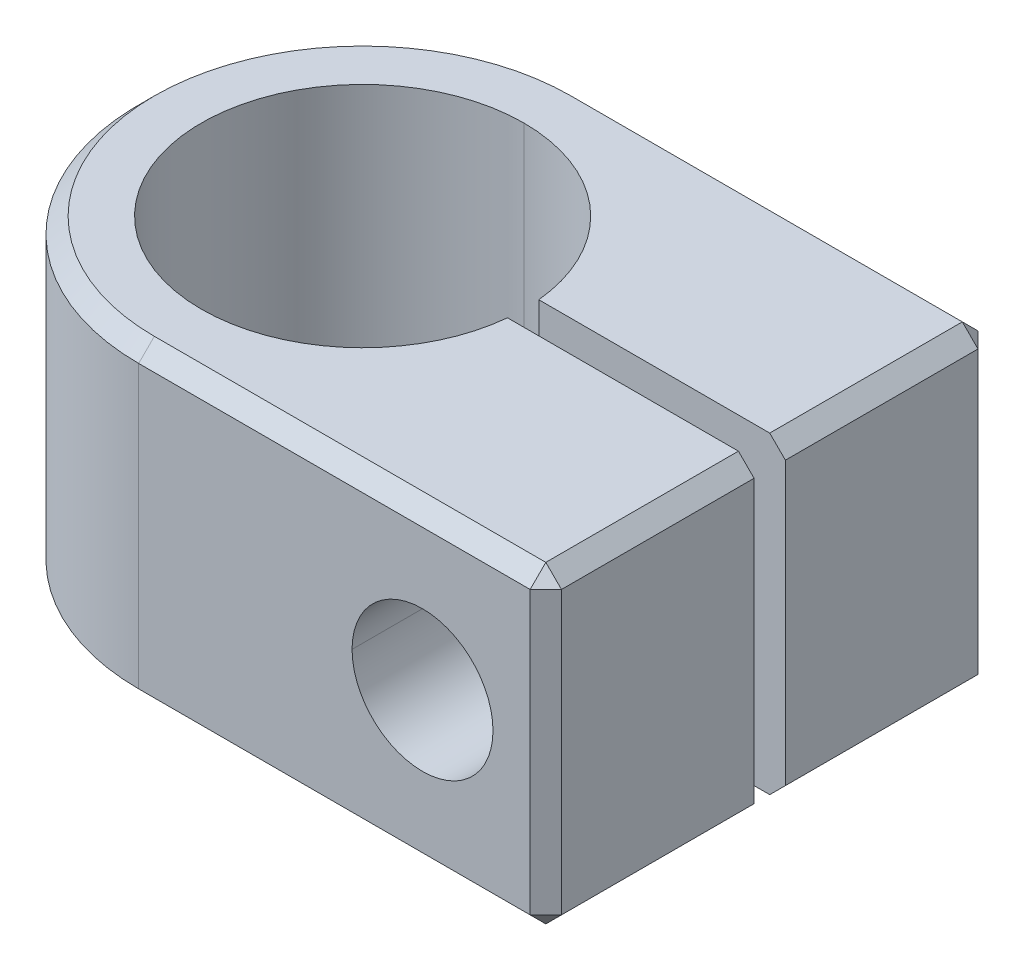
ISO-10303-21;
HEADER;
FILE_DESCRIPTION(('STEP AP214'),'2;1');
FILE_NAME('part.step','',(''),(''),'','','');
FILE_SCHEMA(('AUTOMOTIVE_DESIGN { 1 0 10303 214 1 1 1 1 }'));
ENDSEC;
DATA;
#1=APPLICATION_CONTEXT('core data for automotive mechanical design processes');
#2=APPLICATION_PROTOCOL_DEFINITION('international standard','automotive_design',2000,#1);
#3=PRODUCT_CONTEXT('',#1,'mechanical');
#4=PRODUCT('Part','Part','',(#3));
#5=PRODUCT_RELATED_PRODUCT_CATEGORY('part','',(#4));
#6=PRODUCT_DEFINITION_FORMATION('','',#4);
#7=PRODUCT_DEFINITION_CONTEXT('part definition',#1,'design');
#8=PRODUCT_DEFINITION('design','',#6,#7);
#9=PRODUCT_DEFINITION_SHAPE('','',#8);
#10=(LENGTH_UNIT() NAMED_UNIT(*) SI_UNIT(.MILLI.,.METRE.));
#11=(NAMED_UNIT(*) PLANE_ANGLE_UNIT() SI_UNIT($,.RADIAN.));
#12=(NAMED_UNIT(*) SI_UNIT($,.STERADIAN.) SOLID_ANGLE_UNIT());
#13=UNCERTAINTY_MEASURE_WITH_UNIT(LENGTH_MEASURE(1.E-05),#10,'distance_accuracy_value','');
#14=(GEOMETRIC_REPRESENTATION_CONTEXT(3) GLOBAL_UNCERTAINTY_ASSIGNED_CONTEXT((#13)) GLOBAL_UNIT_ASSIGNED_CONTEXT((#10,
#11,#12)) REPRESENTATION_CONTEXT('',''));
#15=CARTESIAN_POINT('',(0.,0.,0.));
#16=DIRECTION('',(0.,0.,1.));
#17=DIRECTION('',(1.,0.,0.));
#18=AXIS2_PLACEMENT_3D('',#15,#16,#17);
#19=CARTESIAN_POINT('',(13.,0.5,-7.15));
#20=DIRECTION('',(-0.707106781186548,0.707106781186548,0.));
#21=DIRECTION('',(0.,0.,1.));
#22=AXIS2_PLACEMENT_3D('',#19,#20,#21);
#23=PLANE('',#22);
#24=DIRECTION('',(0.707106781186548,0.707106781186548,0.));
#25=VECTOR('',#24,1.);
#26=CARTESIAN_POINT('',(13.,0.5,-0.5));
#27=LINE('',#26,#25);
#28=CARTESIAN_POINT('',(12.5,0.,-0.5));
#29=VERTEX_POINT('',#28);
#30=CARTESIAN_POINT('',(13.,0.5,-0.5));
#31=VERTEX_POINT('',#30);
#32=EDGE_CURVE('E200',#29,#31,#27,.T.);
#33=ORIENTED_EDGE('',*,*,#32,.F.);
#34=DIRECTION('',(0.,0.,1.));
#35=VECTOR('',#34,1.);
#36=CARTESIAN_POINT('',(12.5,0.,0.));
#37=LINE('',#36,#35);
#38=CARTESIAN_POINT('',(12.5,0.,-6.65));
#39=VERTEX_POINT('',#38);
#40=EDGE_CURVE('E1141',#39,#29,#37,.T.);
#41=ORIENTED_EDGE('',*,*,#40,.F.);
#42=DIRECTION('',(0.707106781186548,0.707106781186548,0.));
#43=VECTOR('',#42,1.);
#44=CARTESIAN_POINT('',(13.,0.5,-6.65));
#45=LINE('',#44,#43);
#46=CARTESIAN_POINT('',(13.,0.5,-6.65));
#47=VERTEX_POINT('',#46);
#48=EDGE_CURVE('E11',#39,#47,#45,.T.);
#49=ORIENTED_EDGE('',*,*,#48,.T.);
#50=DIRECTION('',(0.,0.,-1.));
#51=VECTOR('',#50,1.);
#52=CARTESIAN_POINT('',(13.,0.5,-7.15));
#53=LINE('',#52,#51);
#54=EDGE_CURVE('E1026',#31,#47,#53,.T.);
#55=ORIENTED_EDGE('',*,*,#54,.F.);
#56=EDGE_LOOP('',(#33,#41,#49,#55));
#57=FACE_BOUND('',#56,.T.);
#58=ADVANCED_FACE('F17',(#57),#23,.F.);
#59=CARTESIAN_POINT('',(13.,0.5,-6.65));
#60=DIRECTION('',(0.577350269189621,-0.577350269189629,-0.577350269189627));
#61=DIRECTION('',(0.,0.707106781186546,-0.707106781186549));
#62=AXIS2_PLACEMENT_3D('',#59,#60,#61);
#63=PLANE('',#62);
#64=DIRECTION('',(0.,0.707106781186546,-0.707106781186549));
#65=VECTOR('',#64,1.);
#66=CARTESIAN_POINT('',(12.5,0.25,-6.9));
#67=LINE('',#66,#65);
#68=CARTESIAN_POINT('',(12.5,0.5,-7.15));
#69=VERTEX_POINT('',#68);
#70=EDGE_CURVE('E26',#39,#69,#67,.T.);
#71=ORIENTED_EDGE('',*,*,#70,.T.);
#72=DIRECTION('',(0.707106781186548,0.,0.707106781186548));
#73=VECTOR('',#72,1.);
#74=CARTESIAN_POINT('',(13.,0.5,-6.65));
#75=LINE('',#74,#73);
#76=EDGE_CURVE('E256',#69,#47,#75,.T.);
#77=ORIENTED_EDGE('',*,*,#76,.T.);
#78=ORIENTED_EDGE('',*,*,#48,.F.);
#79=EDGE_LOOP('',(#71,#77,#78));
#80=FACE_BOUND('',#79,.T.);
#81=ADVANCED_FACE('F19',(#80),#63,.T.);
#82=CARTESIAN_POINT('',(0.,0.5,-7.15));
#83=DIRECTION('',(0.,0.707106781186549,0.707106781186546));
#84=DIRECTION('',(1.,0.,0.));
#85=AXIS2_PLACEMENT_3D('',#82,#83,#84);
#86=PLANE('',#85);
#87=DIRECTION('',(0.,0.707106781186546,-0.707106781186549));
#88=VECTOR('',#87,1.);
#89=CARTESIAN_POINT('',(0.,0.,-6.65));
#90=LINE('',#89,#88);
#91=CARTESIAN_POINT('',(0.,0.,-6.65));
#92=VERTEX_POINT('',#91);
#93=CARTESIAN_POINT('',(0.,0.5,-7.15));
#94=VERTEX_POINT('',#93);
#95=EDGE_CURVE('E253',#92,#94,#90,.T.);
#96=ORIENTED_EDGE('',*,*,#95,.T.);
#97=DIRECTION('',(-1.,0.,0.));
#98=VECTOR('',#97,1.);
#99=CARTESIAN_POINT('',(0.,0.5,-7.15));
#100=LINE('',#99,#98);
#101=EDGE_CURVE('E209',#69,#94,#100,.T.);
#102=ORIENTED_EDGE('',*,*,#101,.F.);
#103=ORIENTED_EDGE('',*,*,#70,.F.);
#104=DIRECTION('',(1.,0.,0.));
#105=VECTOR('',#104,1.);
#106=CARTESIAN_POINT('',(0.,0.,-6.65));
#107=LINE('',#106,#105);
#108=EDGE_CURVE('E1137',#92,#39,#107,.T.);
#109=ORIENTED_EDGE('',*,*,#108,.F.);
#110=EDGE_LOOP('',(#96,#102,#103,#109));
#111=FACE_BOUND('',#110,.T.);
#112=ADVANCED_FACE('F757',(#111),#86,.F.);
#113=CARTESIAN_POINT('',(12.5,10.,-7.15));
#114=DIRECTION('',(-0.707106781186548,0.,0.707106781186548));
#115=DIRECTION('',(0.,1.,0.));
#116=AXIS2_PLACEMENT_3D('',#113,#114,#115);
#117=PLANE('',#116);
#118=DIRECTION('',(0.707106781186548,0.,0.707106781186548));
#119=VECTOR('',#118,1.);
#120=CARTESIAN_POINT('',(13.,9.5,-6.65));
#121=LINE('',#120,#119);
#122=CARTESIAN_POINT('',(12.5,9.5,-7.15));
#123=VERTEX_POINT('',#122);
#124=CARTESIAN_POINT('',(13.,9.5,-6.65));
#125=VERTEX_POINT('',#124);
#126=EDGE_CURVE('E52',#123,#125,#121,.T.);
#127=ORIENTED_EDGE('',*,*,#126,.T.);
#128=DIRECTION('',(0.,1.,0.));
#129=VECTOR('',#128,1.);
#130=CARTESIAN_POINT('',(13.,10.,-6.65));
#131=LINE('',#130,#129);
#132=EDGE_CURVE('E1029',#47,#125,#131,.T.);
#133=ORIENTED_EDGE('',*,*,#132,.F.);
#134=ORIENTED_EDGE('',*,*,#76,.F.);
#135=DIRECTION('',(0.,-1.,0.));
#136=VECTOR('',#135,1.);
#137=CARTESIAN_POINT('',(12.5,10.,-7.15));
#138=LINE('',#137,#136);
#139=EDGE_CURVE('E208',#123,#69,#138,.T.);
#140=ORIENTED_EDGE('',*,*,#139,.F.);
#141=EDGE_LOOP('',(#127,#133,#134,#140));
#142=FACE_BOUND('',#141,.T.);
#143=ADVANCED_FACE('F746',(#142),#117,.F.);
#144=CARTESIAN_POINT('',(0.,0.5,0.));
#145=DIRECTION('',(0.,1.,0.));
#146=DIRECTION('',(0.,0.,1.));
#147=AXIS2_PLACEMENT_3D('',#144,#145,#146);
#148=CONICAL_SURFACE('',#147,7.15,0.78539816339745);
#149=DIRECTION('',(0.,0.707106781186546,0.707106781186549));
#150=VECTOR('',#149,1.);
#151=CARTESIAN_POINT('',(0.,0.,6.65));
#152=LINE('',#151,#150);
#153=CARTESIAN_POINT('',(0.,0.,6.65));
#154=VERTEX_POINT('',#153);
#155=CARTESIAN_POINT('',(0.,0.5,7.15));
#156=VERTEX_POINT('',#155);
#157=EDGE_CURVE('E202',#154,#156,#152,.T.);
#158=ORIENTED_EDGE('',*,*,#157,.T.);
#159=CARTESIAN_POINT('',(0.,0.5,0.));
#160=DIRECTION('',(0.,1.,0.));
#161=DIRECTION('',(0.,0.,1.));
#162=AXIS2_PLACEMENT_3D('',#159,#160,#161);
#163=CIRCLE('',#162,7.15);
#164=EDGE_CURVE('E1093',#94,#156,#163,.T.);
#165=ORIENTED_EDGE('',*,*,#164,.F.);
#166=ORIENTED_EDGE('',*,*,#95,.F.);
#167=CARTESIAN_POINT('',(0.,0.,0.));
#168=DIRECTION('',(0.,-1.,0.));
#169=DIRECTION('',(0.,0.,1.));
#170=AXIS2_PLACEMENT_3D('',#167,#168,#169);
#171=CIRCLE('',#170,6.65);
#172=EDGE_CURVE('E1110',#154,#92,#171,.T.);
#173=ORIENTED_EDGE('',*,*,#172,.F.);
#174=EDGE_LOOP('',(#158,#165,#166,#173));
#175=FACE_BOUND('',#174,.T.);
#176=ADVANCED_FACE('F736',(#175),#148,.T.);
#177=CARTESIAN_POINT('',(13.,9.5,-6.65));
#178=DIRECTION('',(0.577350269189624,0.577350269189628,-0.577350269189626));
#179=DIRECTION('',(-0.707106781186549,0.,-0.707106781186546));
#180=AXIS2_PLACEMENT_3D('',#177,#178,#179);
#181=PLANE('',#180);
#182=DIRECTION('',(0.,0.707106781186546,0.707106781186549));
#183=VECTOR('',#182,1.);
#184=CARTESIAN_POINT('',(12.5,9.75,-6.9));
#185=LINE('',#184,#183);
#186=CARTESIAN_POINT('',(12.5,10.,-6.65));
#187=VERTEX_POINT('',#186);
#188=EDGE_CURVE('E205',#123,#187,#185,.T.);
#189=ORIENTED_EDGE('',*,*,#188,.T.);
#190=DIRECTION('',(0.707106781186548,-0.707106781186548,0.));
#191=VECTOR('',#190,1.);
#192=CARTESIAN_POINT('',(13.,9.5,-6.65));
#193=LINE('',#192,#191);
#194=EDGE_CURVE('E248',#187,#125,#193,.T.);
#195=ORIENTED_EDGE('',*,*,#194,.T.);
#196=ORIENTED_EDGE('',*,*,#126,.F.);
#197=EDGE_LOOP('',(#189,#195,#196));
#198=FACE_BOUND('',#197,.T.);
#199=ADVANCED_FACE('F705',(#198),#181,.T.);
#200=CARTESIAN_POINT('',(13.,0.5,7.15));
#201=DIRECTION('',(0.,0.707106781186549,-0.707106781186546));
#202=DIRECTION('',(-1.,0.,0.));
#203=AXIS2_PLACEMENT_3D('',#200,#201,#202);
#204=PLANE('',#203);
#205=DIRECTION('',(0.,0.707106781186546,0.707106781186549));
#206=VECTOR('',#205,1.);
#207=CARTESIAN_POINT('',(12.5,0.,6.65));
#208=LINE('',#207,#206);
#209=CARTESIAN_POINT('',(12.5,0.,6.65));
#210=VERTEX_POINT('',#209);
#211=CARTESIAN_POINT('',(12.5,0.5,7.15));
#212=VERTEX_POINT('',#211);
#213=EDGE_CURVE('E245',#210,#212,#208,.T.);
#214=ORIENTED_EDGE('',*,*,#213,.T.);
#215=DIRECTION('',(1.,0.,0.));
#216=VECTOR('',#215,1.);
#217=CARTESIAN_POINT('',(13.,0.5,7.15));
#218=LINE('',#217,#216);
#219=EDGE_CURVE('E1052',#156,#212,#218,.T.);
#220=ORIENTED_EDGE('',*,*,#219,.F.);
#221=ORIENTED_EDGE('',*,*,#157,.F.);
#222=DIRECTION('',(-1.,0.,0.));
#223=VECTOR('',#222,1.);
#224=CARTESIAN_POINT('',(0.,0.,6.65));
#225=LINE('',#224,#223);
#226=EDGE_CURVE('E1150',#210,#154,#225,.T.);
#227=ORIENTED_EDGE('',*,*,#226,.F.);
#228=EDGE_LOOP('',(#214,#220,#221,#227));
#229=FACE_BOUND('',#228,.T.);
#230=ADVANCED_FACE('F700',(#229),#204,.F.);
#231=CARTESIAN_POINT('',(0.,10.,-6.65));
#232=DIRECTION('',(0.,0.707106781186549,-0.707106781186546));
#233=DIRECTION('',(-1.,0.,0.));
#234=AXIS2_PLACEMENT_3D('',#231,#232,#233);
#235=PLANE('',#234);
#236=DIRECTION('',(0.,0.707106781186546,0.707106781186549));
#237=VECTOR('',#236,1.);
#238=CARTESIAN_POINT('',(0.,9.5,-7.15));
#239=LINE('',#238,#237);
#240=CARTESIAN_POINT('',(0.,9.5,-7.15));
#241=VERTEX_POINT('',#240);
#242=CARTESIAN_POINT('',(0.,10.,-6.65));
#243=VERTEX_POINT('',#242);
#244=EDGE_CURVE('E221',#241,#243,#239,.T.);
#245=ORIENTED_EDGE('',*,*,#244,.T.);
#246=DIRECTION('',(-1.,0.,0.));
#247=VECTOR('',#246,1.);
#248=CARTESIAN_POINT('',(0.,10.,-6.65));
#249=LINE('',#248,#247);
#250=EDGE_CURVE('E1114',#187,#243,#249,.T.);
#251=ORIENTED_EDGE('',*,*,#250,.F.);
#252=ORIENTED_EDGE('',*,*,#188,.F.);
#253=DIRECTION('',(1.,0.,0.));
#254=VECTOR('',#253,1.);
#255=CARTESIAN_POINT('',(13.,9.5,-7.15));
#256=LINE('',#255,#254);
#257=EDGE_CURVE('E213',#241,#123,#256,.T.);
#258=ORIENTED_EDGE('',*,*,#257,.F.);
#259=EDGE_LOOP('',(#245,#251,#252,#258));
#260=FACE_BOUND('',#259,.T.);
#261=ADVANCED_FACE('F704',(#260),#235,.T.);
#262=CARTESIAN_POINT('',(12.5,10.,0.));
#263=DIRECTION('',(0.707106781186548,0.707106781186548,0.));
#264=DIRECTION('',(0.,0.,-1.));
#265=AXIS2_PLACEMENT_3D('',#262,#263,#264);
#266=PLANE('',#265);
#267=DIRECTION('',(-0.707106781186548,0.707106781186548,0.));
#268=VECTOR('',#267,1.);
#269=CARTESIAN_POINT('',(12.5,10.,-0.5));
#270=LINE('',#269,#268);
#271=CARTESIAN_POINT('',(13.,9.5,-0.5));
#272=VERTEX_POINT('',#271);
#273=CARTESIAN_POINT('',(12.5,10.,-0.5));
#274=VERTEX_POINT('',#273);
#275=EDGE_CURVE('E197',#272,#274,#270,.T.);
#276=ORIENTED_EDGE('',*,*,#275,.F.);
#277=DIRECTION('',(0.,0.,1.));
#278=VECTOR('',#277,1.);
#279=CARTESIAN_POINT('',(13.,9.5,-0.5));
#280=LINE('',#279,#278);
#281=EDGE_CURVE('E1033',#125,#272,#280,.T.);
#282=ORIENTED_EDGE('',*,*,#281,.F.);
#283=ORIENTED_EDGE('',*,*,#194,.F.);
#284=DIRECTION('',(0.,0.,-1.));
#285=VECTOR('',#284,1.);
#286=CARTESIAN_POINT('',(12.5,10.,-7.15));
#287=LINE('',#286,#285);
#288=EDGE_CURVE('E1106',#274,#187,#287,.T.);
#289=ORIENTED_EDGE('',*,*,#288,.F.);
#290=EDGE_LOOP('',(#276,#282,#283,#289));
#291=FACE_BOUND('',#290,.T.);
#292=ADVANCED_FACE('F692',(#291),#266,.T.);
#293=CARTESIAN_POINT('',(12.5,0.,6.65));
#294=DIRECTION('',(0.577350269189621,-0.577350269189629,0.577350269189627));
#295=DIRECTION('',(-0.707106781186553,-0.707106781186543,0.));
#296=AXIS2_PLACEMENT_3D('',#293,#294,#295);
#297=PLANE('',#296);
#298=DIRECTION('',(0.707106781186548,0.707106781186548,0.));
#299=VECTOR('',#298,1.);
#300=CARTESIAN_POINT('',(12.5,0.,6.65));
#301=LINE('',#300,#299);
#302=CARTESIAN_POINT('',(13.,0.5,6.65));
#303=VERTEX_POINT('',#302);
#304=EDGE_CURVE('E218',#210,#303,#301,.T.);
#305=ORIENTED_EDGE('',*,*,#304,.T.);
#306=DIRECTION('',(-0.707106781186548,0.,0.707106781186548));
#307=VECTOR('',#306,1.);
#308=CARTESIAN_POINT('',(12.75,0.5,6.9));
#309=LINE('',#308,#307);
#310=EDGE_CURVE('E222',#303,#212,#309,.T.);
#311=ORIENTED_EDGE('',*,*,#310,.T.);
#312=ORIENTED_EDGE('',*,*,#213,.F.);
#313=EDGE_LOOP('',(#305,#311,#312));
#314=FACE_BOUND('',#313,.T.);
#315=ADVANCED_FACE('F681',(#314),#297,.T.);
#316=CARTESIAN_POINT('',(0.,10.,0.));
#317=DIRECTION('',(0.,-1.,0.));
#318=DIRECTION('',(0.,0.,-1.));
#319=AXIS2_PLACEMENT_3D('',#316,#317,#318);
#320=CONICAL_SURFACE('',#319,6.65,0.78539816339745);
#321=DIRECTION('',(0.,0.707106781186546,-0.707106781186549));
#322=VECTOR('',#321,1.);
#323=CARTESIAN_POINT('',(0.,9.5,7.15));
#324=LINE('',#323,#322);
#325=CARTESIAN_POINT('',(0.,9.5,7.15));
#326=VERTEX_POINT('',#325);
#327=CARTESIAN_POINT('',(0.,10.,6.65));
#328=VERTEX_POINT('',#327);
#329=EDGE_CURVE('E244',#326,#328,#324,.T.);
#330=ORIENTED_EDGE('',*,*,#329,.T.);
#331=CARTESIAN_POINT('',(0.,10.,0.));
#332=DIRECTION('',(0.,1.,0.));
#333=DIRECTION('',(0.,0.,1.));
#334=AXIS2_PLACEMENT_3D('',#331,#332,#333);
#335=CIRCLE('',#334,6.65);
#336=EDGE_CURVE('E1118',#243,#328,#335,.T.);
#337=ORIENTED_EDGE('',*,*,#336,.F.);
#338=ORIENTED_EDGE('',*,*,#244,.F.);
#339=CARTESIAN_POINT('',(0.,9.5,0.));
#340=DIRECTION('',(0.,-1.,0.));
#341=DIRECTION('',(0.,0.,1.));
#342=AXIS2_PLACEMENT_3D('',#339,#340,#341);
#343=CIRCLE('',#342,7.15);
#344=EDGE_CURVE('E1057',#326,#241,#343,.T.);
#345=ORIENTED_EDGE('',*,*,#344,.F.);
#346=EDGE_LOOP('',(#330,#337,#338,#345));
#347=FACE_BOUND('',#346,.T.);
#348=ADVANCED_FACE('F671',(#347),#320,.T.);
#349=CARTESIAN_POINT('',(13.,0.5,-7.15));
#350=DIRECTION('',(-0.707106781186548,0.707106781186548,0.));
#351=DIRECTION('',(0.,0.,1.));
#352=AXIS2_PLACEMENT_3D('',#349,#350,#351);
#353=PLANE('',#352);
#354=DIRECTION('',(-0.707106781186548,-0.707106781186548,0.));
#355=VECTOR('',#354,1.);
#356=CARTESIAN_POINT('',(13.,0.5,0.5));
#357=LINE('',#356,#355);
#358=CARTESIAN_POINT('',(13.,0.5,0.5));
#359=VERTEX_POINT('',#358);
#360=CARTESIAN_POINT('',(12.5,0.,0.5));
#361=VERTEX_POINT('',#360);
#362=EDGE_CURVE('E156',#359,#361,#357,.T.);
#363=ORIENTED_EDGE('',*,*,#362,.F.);
#364=DIRECTION('',(0.,0.,-1.));
#365=VECTOR('',#364,1.);
#366=CARTESIAN_POINT('',(13.,0.5,-7.15));
#367=LINE('',#366,#365);
#368=EDGE_CURVE('E161',#303,#359,#367,.T.);
#369=ORIENTED_EDGE('',*,*,#368,.F.);
#370=ORIENTED_EDGE('',*,*,#304,.F.);
#371=DIRECTION('',(0.,0.,1.));
#372=VECTOR('',#371,1.);
#373=CARTESIAN_POINT('',(12.5,0.,0.));
#374=LINE('',#373,#372);
#375=EDGE_CURVE('E164',#361,#210,#374,.T.);
#376=ORIENTED_EDGE('',*,*,#375,.F.);
#377=EDGE_LOOP('',(#363,#369,#370,#376));
#378=FACE_BOUND('',#377,.T.);
#379=ADVANCED_FACE('F158',(#378),#353,.F.);
#380=CARTESIAN_POINT('',(13.,10.,6.65));
#381=DIRECTION('',(-0.707106781186548,0.,-0.707106781186548));
#382=DIRECTION('',(-0.707106781186548,0.,0.707106781186548));
#383=AXIS2_PLACEMENT_3D('',#380,#381,#382);
#384=PLANE('',#383);
#385=DIRECTION('',(-0.707106781186548,0.,0.707106781186548));
#386=VECTOR('',#385,1.);
#387=CARTESIAN_POINT('',(12.5,9.5,7.15));
#388=LINE('',#387,#386);
#389=CARTESIAN_POINT('',(13.,9.5,6.65));
#390=VERTEX_POINT('',#389);
#391=CARTESIAN_POINT('',(12.5,9.5,7.15));
#392=VERTEX_POINT('',#391);
#393=EDGE_CURVE('E236',#390,#392,#388,.T.);
#394=ORIENTED_EDGE('',*,*,#393,.T.);
#395=DIRECTION('',(0.,1.,0.));
#396=VECTOR('',#395,1.);
#397=CARTESIAN_POINT('',(12.5,10.,7.15));
#398=LINE('',#397,#396);
#399=EDGE_CURVE('E1056',#212,#392,#398,.T.);
#400=ORIENTED_EDGE('',*,*,#399,.F.);
#401=ORIENTED_EDGE('',*,*,#310,.F.);
#402=DIRECTION('',(0.,-1.,0.));
#403=VECTOR('',#402,1.);
#404=CARTESIAN_POINT('',(13.,10.,6.65));
#405=LINE('',#404,#403);
#406=EDGE_CURVE('E184',#390,#303,#405,.T.);
#407=ORIENTED_EDGE('',*,*,#406,.F.);
#408=EDGE_LOOP('',(#394,#400,#401,#407));
#409=FACE_BOUND('',#408,.T.);
#410=ADVANCED_FACE('F650',(#409),#384,.F.);
#411=CARTESIAN_POINT('',(0.,10.,6.65));
#412=DIRECTION('',(0.,0.707106781186549,0.707106781186546));
#413=DIRECTION('',(1.,0.,0.));
#414=AXIS2_PLACEMENT_3D('',#411,#412,#413);
#415=PLANE('',#414);
#416=DIRECTION('',(0.,0.707106781186546,-0.707106781186549));
#417=VECTOR('',#416,1.);
#418=CARTESIAN_POINT('',(12.5,9.5,7.15));
#419=LINE('',#418,#417);
#420=CARTESIAN_POINT('',(12.5,10.,6.65));
#421=VERTEX_POINT('',#420);
#422=EDGE_CURVE('E240',#392,#421,#419,.T.);
#423=ORIENTED_EDGE('',*,*,#422,.T.);
#424=DIRECTION('',(1.,0.,0.));
#425=VECTOR('',#424,1.);
#426=CARTESIAN_POINT('',(13.,10.,6.65));
#427=LINE('',#426,#425);
#428=EDGE_CURVE('E1122',#328,#421,#427,.T.);
#429=ORIENTED_EDGE('',*,*,#428,.F.);
#430=ORIENTED_EDGE('',*,*,#329,.F.);
#431=DIRECTION('',(-1.,0.,0.));
#432=VECTOR('',#431,1.);
#433=CARTESIAN_POINT('',(0.,9.5,7.15));
#434=LINE('',#433,#432);
#435=EDGE_CURVE('E195',#392,#326,#434,.T.);
#436=ORIENTED_EDGE('',*,*,#435,.F.);
#437=EDGE_LOOP('',(#423,#429,#430,#436));
#438=FACE_BOUND('',#437,.T.);
#439=ADVANCED_FACE('F639',(#438),#415,.T.);
#440=CARTESIAN_POINT('',(12.5,9.5,7.15));
#441=DIRECTION('',(0.577350269189624,0.577350269189628,0.577350269189626));
#442=DIRECTION('',(0.707106781186549,0.,-0.707106781186546));
#443=AXIS2_PLACEMENT_3D('',#440,#441,#442);
#444=PLANE('',#443);
#445=ORIENTED_EDGE('',*,*,#393,.F.);
#446=DIRECTION('',(-0.707106781186548,0.707106781186548,0.));
#447=VECTOR('',#446,1.);
#448=CARTESIAN_POINT('',(12.75,9.75,6.65));
#449=LINE('',#448,#447);
#450=EDGE_CURVE('E232',#390,#421,#449,.T.);
#451=ORIENTED_EDGE('',*,*,#450,.T.);
#452=ORIENTED_EDGE('',*,*,#422,.F.);
#453=EDGE_LOOP('',(#445,#451,#452));
#454=FACE_BOUND('',#453,.T.);
#455=ADVANCED_FACE('F628',(#454),#444,.T.);
#456=CARTESIAN_POINT('',(12.5,10.,0.));
#457=DIRECTION('',(0.707106781186548,0.707106781186548,0.));
#458=DIRECTION('',(0.,0.,-1.));
#459=AXIS2_PLACEMENT_3D('',#456,#457,#458);
#460=PLANE('',#459);
#461=ORIENTED_EDGE('',*,*,#450,.F.);
#462=DIRECTION('',(0.,0.,1.));
#463=VECTOR('',#462,1.);
#464=CARTESIAN_POINT('',(13.,9.5,7.15));
#465=LINE('',#464,#463);
#466=CARTESIAN_POINT('',(13.,9.5,0.5));
#467=VERTEX_POINT('',#466);
#468=EDGE_CURVE('E180',#467,#390,#465,.T.);
#469=ORIENTED_EDGE('',*,*,#468,.F.);
#470=DIRECTION('',(0.707106781186548,-0.707106781186548,0.));
#471=VECTOR('',#470,1.);
#472=CARTESIAN_POINT('',(12.5,10.,0.5));
#473=LINE('',#472,#471);
#474=CARTESIAN_POINT('',(12.5,10.,0.5));
#475=VERTEX_POINT('',#474);
#476=EDGE_CURVE('E169',#475,#467,#473,.T.);
#477=ORIENTED_EDGE('',*,*,#476,.F.);
#478=DIRECTION('',(0.,0.,-1.));
#479=VECTOR('',#478,1.);
#480=CARTESIAN_POINT('',(12.5,10.,0.5));
#481=LINE('',#480,#479);
#482=EDGE_CURVE('E1126',#421,#475,#481,.T.);
#483=ORIENTED_EDGE('',*,*,#482,.F.);
#484=EDGE_LOOP('',(#461,#469,#477,#483));
#485=FACE_BOUND('',#484,.T.);
#486=ADVANCED_FACE('F617',(#485),#460,.T.);
#487=CARTESIAN_POINT('',(9.06283534391111,5.,-7.15));
#488=DIRECTION('',(0.,0.,1.));
#489=DIRECTION('',(1.,0.,0.));
#490=AXIS2_PLACEMENT_3D('',#487,#488,#489);
#491=CYLINDRICAL_SURFACE('',#490,2.25);
#492=DIRECTION('',(0.,0.,1.));
#493=VECTOR('',#492,1.);
#494=CARTESIAN_POINT('',(6.81283534391111,5.,-7.15));
#495=LINE('',#494,#493);
#496=CARTESIAN_POINT('',(6.81283534391111,5.,0.5));
#497=VERTEX_POINT('',#496);
#498=CARTESIAN_POINT('',(6.81283534391111,5.,7.15));
#499=VERTEX_POINT('',#498);
#500=EDGE_CURVE('E1208',#497,#499,#495,.T.);
#501=ORIENTED_EDGE('',*,*,#500,.F.);
#502=CARTESIAN_POINT('',(9.06283534391111,5.,0.5));
#503=DIRECTION('',(0.,0.,1.));
#504=DIRECTION('',(1.,0.,0.));
#505=AXIS2_PLACEMENT_3D('',#502,#503,#504);
#506=CIRCLE('',#505,2.25);
#507=CARTESIAN_POINT('',(11.3128353439111,5.,0.5));
#508=VERTEX_POINT('',#507);
#509=EDGE_CURVE('E228',#508,#497,#506,.T.);
#510=ORIENTED_EDGE('',*,*,#509,.F.);
#511=DIRECTION('',(0.,0.,1.));
#512=VECTOR('',#511,1.);
#513=CARTESIAN_POINT('',(11.3128353439111,5.,-7.15));
#514=LINE('',#513,#512);
#515=CARTESIAN_POINT('',(11.3128353439111,5.,7.15));
#516=VERTEX_POINT('',#515);
#517=EDGE_CURVE('E1045',#508,#516,#514,.T.);
#518=ORIENTED_EDGE('',*,*,#517,.T.);
#519=CARTESIAN_POINT('',(9.06283534391111,5.,7.15));
#520=DIRECTION('',(0.,0.,1.));
#521=DIRECTION('',(1.,0.,0.));
#522=AXIS2_PLACEMENT_3D('',#519,#520,#521);
#523=CIRCLE('',#522,2.25);
#524=EDGE_CURVE('E191',#516,#499,#523,.T.);
#525=ORIENTED_EDGE('',*,*,#524,.T.);
#526=EDGE_LOOP('',(#501,#510,#518,#525));
#527=FACE_BOUND('',#526,.T.);
#528=ADVANCED_FACE('F606',(#527),#491,.F.);
#529=CARTESIAN_POINT('',(9.06283534391111,5.,-7.15));
#530=DIRECTION('',(0.,0.,1.));
#531=DIRECTION('',(1.,0.,0.));
#532=AXIS2_PLACEMENT_3D('',#529,#530,#531);
#533=CYLINDRICAL_SURFACE('',#532,2.25);
#534=DIRECTION('',(0.,0.,1.));
#535=VECTOR('',#534,1.);
#536=CARTESIAN_POINT('',(6.81283534391111,5.,-7.15));
#537=LINE('',#536,#535);
#538=CARTESIAN_POINT('',(6.81283534391111,5.,-7.15));
#539=VERTEX_POINT('',#538);
#540=CARTESIAN_POINT('',(6.81283534391111,5.,-0.5));
#541=VERTEX_POINT('',#540);
#542=EDGE_CURVE('E1050',#539,#541,#537,.T.);
#543=ORIENTED_EDGE('',*,*,#542,.F.);
#544=CARTESIAN_POINT('',(9.06283534391111,5.,-7.15));
#545=DIRECTION('',(0.,0.,1.));
#546=DIRECTION('',(1.,0.,0.));
#547=AXIS2_PLACEMENT_3D('',#544,#545,#546);
#548=CIRCLE('',#547,2.25);
#549=CARTESIAN_POINT('',(11.3128353439111,5.,-7.15));
#550=VERTEX_POINT('',#549);
#551=EDGE_CURVE('E217',#550,#539,#548,.T.);
#552=ORIENTED_EDGE('',*,*,#551,.F.);
#553=DIRECTION('',(0.,0.,1.));
#554=VECTOR('',#553,1.);
#555=CARTESIAN_POINT('',(11.3128353439111,5.,-7.15));
#556=LINE('',#555,#554);
#557=CARTESIAN_POINT('',(11.3128353439111,5.,-0.5));
#558=VERTEX_POINT('',#557);
#559=EDGE_CURVE('E1049',#550,#558,#556,.T.);
#560=ORIENTED_EDGE('',*,*,#559,.T.);
#561=CARTESIAN_POINT('',(9.06283534391111,5.,-0.5));
#562=DIRECTION('',(0.,0.,-1.));
#563=DIRECTION('',(-1.,0.,0.));
#564=AXIS2_PLACEMENT_3D('',#561,#562,#563);
#565=CIRCLE('',#564,2.25);
#566=EDGE_CURVE('E199',#541,#558,#565,.T.);
#567=ORIENTED_EDGE('',*,*,#566,.F.);
#568=EDGE_LOOP('',(#543,#552,#560,#567));
#569=FACE_BOUND('',#568,.T.);
#570=ADVANCED_FACE('F595',(#569),#533,.F.);
#571=CARTESIAN_POINT('',(0.,-0.000999999999999265,-0.5));
#572=DIRECTION('',(0.,0.,-1.));
#573=DIRECTION('',(-1.,0.,0.));
#574=AXIS2_PLACEMENT_3D('',#571,#572,#573);
#575=PLANE('',#574);
#576=CARTESIAN_POINT('',(9.06283534391111,5.,-0.5));
#577=DIRECTION('',(0.,0.,-1.));
#578=DIRECTION('',(-1.,0.,0.));
#579=AXIS2_PLACEMENT_3D('',#576,#577,#578);
#580=CIRCLE('',#579,2.25);
#581=EDGE_CURVE('E1046',#558,#541,#580,.T.);
#582=ORIENTED_EDGE('',*,*,#581,.T.);
#583=ORIENTED_EDGE('',*,*,#566,.T.);
#584=EDGE_LOOP('',(#582,#583));
#585=FACE_BOUND('',#584,.T.);
#586=DIRECTION('',(1.,0.,0.));
#587=VECTOR('',#586,1.);
#588=CARTESIAN_POINT('',(0.,0.,-0.5));
#589=LINE('',#588,#587);
#590=CARTESIAN_POINT('',(5.12567068782223,0.,-0.5));
#591=VERTEX_POINT('',#590);
#592=EDGE_CURVE('E1022',#591,#29,#589,.T.);
#593=ORIENTED_EDGE('',*,*,#592,.T.);
#594=ORIENTED_EDGE('',*,*,#32,.T.);
#595=DIRECTION('',(0.,1.,0.));
#596=VECTOR('',#595,1.);
#597=CARTESIAN_POINT('',(13.,-0.000999999999999265,-0.5));
#598=LINE('',#597,#596);
#599=EDGE_CURVE('E1020',#31,#272,#598,.T.);
#600=ORIENTED_EDGE('',*,*,#599,.T.);
#601=ORIENTED_EDGE('',*,*,#275,.T.);
#602=DIRECTION('',(-1.,0.,0.));
#603=VECTOR('',#602,1.);
#604=CARTESIAN_POINT('',(0.,10.,-0.5));
#605=LINE('',#604,#603);
#606=CARTESIAN_POINT('',(5.12567068782223,10.,-0.5));
#607=VERTEX_POINT('',#606);
#608=EDGE_CURVE('E1103',#274,#607,#605,.T.);
#609=ORIENTED_EDGE('',*,*,#608,.T.);
#610=DIRECTION('',(0.,1.,0.));
#611=VECTOR('',#610,1.);
#612=CARTESIAN_POINT('',(5.12567068782223,10.,-0.5));
#613=LINE('',#612,#611);
#614=EDGE_CURVE('E1035',#591,#607,#613,.T.);
#615=ORIENTED_EDGE('',*,*,#614,.F.);
#616=EDGE_LOOP('',(#593,#594,#600,#601,#609,#615));
#617=FACE_BOUND('',#616,.T.);
#618=ADVANCED_FACE('F565',(#585,#617),#575,.F.);
#619=CARTESIAN_POINT('',(0.,-0.000999999999999265,0.5));
#620=DIRECTION('',(0.,0.,1.));
#621=DIRECTION('',(1.,0.,0.));
#622=AXIS2_PLACEMENT_3D('',#619,#620,#621);
#623=PLANE('',#622);
#624=ORIENTED_EDGE('',*,*,#509,.T.);
#625=CARTESIAN_POINT('',(9.06283534391111,5.,0.5));
#626=DIRECTION('',(0.,0.,1.));
#627=DIRECTION('',(1.,0.,0.));
#628=AXIS2_PLACEMENT_3D('',#625,#626,#627);
#629=CIRCLE('',#628,2.25);
#630=EDGE_CURVE('E1217',#497,#508,#629,.T.);
#631=ORIENTED_EDGE('',*,*,#630,.T.);
#632=EDGE_LOOP('',(#624,#631));
#633=FACE_BOUND('',#632,.T.);
#634=DIRECTION('',(0.,1.,0.));
#635=VECTOR('',#634,1.);
#636=CARTESIAN_POINT('',(13.,-0.000999999999999265,0.5));
#637=LINE('',#636,#635);
#638=EDGE_CURVE('E173',#359,#467,#637,.T.);
#639=ORIENTED_EDGE('',*,*,#638,.F.);
#640=ORIENTED_EDGE('',*,*,#362,.T.);
#641=DIRECTION('',(-1.,0.,0.));
#642=VECTOR('',#641,1.);
#643=CARTESIAN_POINT('',(0.,0.,0.5));
#644=LINE('',#643,#642);
#645=CARTESIAN_POINT('',(5.12567068782223,0.,0.5));
#646=VERTEX_POINT('',#645);
#647=EDGE_CURVE('E1075',#361,#646,#644,.T.);
#648=ORIENTED_EDGE('',*,*,#647,.T.);
#649=DIRECTION('',(0.,-1.,0.));
#650=VECTOR('',#649,1.);
#651=CARTESIAN_POINT('',(5.12567068782223,10.,0.5));
#652=LINE('',#651,#650);
#653=CARTESIAN_POINT('',(5.12567068782223,10.,0.5));
#654=VERTEX_POINT('',#653);
#655=EDGE_CURVE('E170',#654,#646,#652,.T.);
#656=ORIENTED_EDGE('',*,*,#655,.F.);
#657=DIRECTION('',(1.,0.,0.));
#658=VECTOR('',#657,1.);
#659=CARTESIAN_POINT('',(0.,10.,0.5));
#660=LINE('',#659,#658);
#661=EDGE_CURVE('E1130',#654,#475,#660,.T.);
#662=ORIENTED_EDGE('',*,*,#661,.T.);
#663=ORIENTED_EDGE('',*,*,#476,.T.);
#664=EDGE_LOOP('',(#639,#640,#648,#656,#662,#663));
#665=FACE_BOUND('',#664,.T.);
#666=ADVANCED_FACE('F174',(#633,#665),#623,.F.);
#667=CARTESIAN_POINT('',(0.,10.,0.));
#668=DIRECTION('',(0.,-1.,0.));
#669=DIRECTION('',(0.,0.,-1.));
#670=AXIS2_PLACEMENT_3D('',#667,#668,#669);
#671=CYLINDRICAL_SURFACE('',#670,5.15);
#672=DIRECTION('',(0.,-1.,0.));
#673=VECTOR('',#672,1.);
#674=CARTESIAN_POINT('',(0.,10.,5.15));
#675=LINE('',#674,#673);
#676=CARTESIAN_POINT('',(0.,10.,5.15));
#677=VERTEX_POINT('',#676);
#678=CARTESIAN_POINT('',(0.,0.,5.15));
#679=VERTEX_POINT('',#678);
#680=EDGE_CURVE('E1066',#677,#679,#675,.T.);
#681=ORIENTED_EDGE('',*,*,#680,.F.);
#682=CARTESIAN_POINT('',(0.,10.,0.));
#683=DIRECTION('',(0.,1.,0.));
#684=DIRECTION('',(0.,0.,1.));
#685=AXIS2_PLACEMENT_3D('',#682,#683,#684);
#686=CIRCLE('',#685,5.15);
#687=EDGE_CURVE('E1132',#677,#654,#686,.T.);
#688=ORIENTED_EDGE('',*,*,#687,.T.);
#689=ORIENTED_EDGE('',*,*,#655,.T.);
#690=CARTESIAN_POINT('',(0.,0.,0.));
#691=DIRECTION('',(0.,1.,0.));
#692=DIRECTION('',(0.,0.,1.));
#693=AXIS2_PLACEMENT_3D('',#690,#691,#692);
#694=CIRCLE('',#693,5.15);
#695=EDGE_CURVE('E1071',#679,#646,#694,.T.);
#696=ORIENTED_EDGE('',*,*,#695,.F.);
#697=EDGE_LOOP('',(#681,#688,#689,#696));
#698=FACE_BOUND('',#697,.T.);
#699=ADVANCED_FACE('F445',(#698),#671,.F.);
#700=CARTESIAN_POINT('',(0.,10.,-7.15));
#701=DIRECTION('',(0.,0.,1.));
#702=DIRECTION('',(1.,0.,0.));
#703=AXIS2_PLACEMENT_3D('',#700,#701,#702);
#704=PLANE('',#703);
#705=ORIENTED_EDGE('',*,*,#551,.T.);
#706=CARTESIAN_POINT('',(9.06283534391111,5.,-7.15));
#707=DIRECTION('',(0.,0.,1.));
#708=DIRECTION('',(1.,0.,0.));
#709=AXIS2_PLACEMENT_3D('',#706,#707,#708);
#710=CIRCLE('',#709,2.25);
#711=EDGE_CURVE('E1058',#539,#550,#710,.T.);
#712=ORIENTED_EDGE('',*,*,#711,.T.);
#713=EDGE_LOOP('',(#705,#712));
#714=FACE_BOUND('',#713,.T.);
#715=ORIENTED_EDGE('',*,*,#139,.T.);
#716=ORIENTED_EDGE('',*,*,#101,.T.);
#717=DIRECTION('',(0.,-1.,0.));
#718=VECTOR('',#717,1.);
#719=CARTESIAN_POINT('',(0.,10.,-7.15));
#720=LINE('',#719,#718);
#721=EDGE_CURVE('E1098',#241,#94,#720,.T.);
#722=ORIENTED_EDGE('',*,*,#721,.F.);
#723=ORIENTED_EDGE('',*,*,#257,.T.);
#724=EDGE_LOOP('',(#715,#716,#722,#723));
#725=FACE_BOUND('',#724,.T.);
#726=ADVANCED_FACE('F440',(#714,#725),#704,.F.);
#727=CARTESIAN_POINT('',(13.,10.,-7.15));
#728=DIRECTION('',(-1.,0.,0.));
#729=DIRECTION('',(0.,0.,1.));
#730=AXIS2_PLACEMENT_3D('',#727,#728,#729);
#731=PLANE('',#730);
#732=ORIENTED_EDGE('',*,*,#406,.T.);
#733=ORIENTED_EDGE('',*,*,#368,.T.);
#734=ORIENTED_EDGE('',*,*,#638,.T.);
#735=ORIENTED_EDGE('',*,*,#468,.T.);
#736=EDGE_LOOP('',(#732,#733,#734,#735));
#737=FACE_BOUND('',#736,.T.);
#738=ADVANCED_FACE('F182',(#737),#731,.F.);
#739=CARTESIAN_POINT('',(13.,10.,7.15));
#740=DIRECTION('',(0.,0.,-1.));
#741=DIRECTION('',(0.,-1.,0.));
#742=AXIS2_PLACEMENT_3D('',#739,#740,#741);
#743=PLANE('',#742);
#744=ORIENTED_EDGE('',*,*,#524,.F.);
#745=CARTESIAN_POINT('',(9.06283534391111,5.,7.15));
#746=DIRECTION('',(0.,0.,1.));
#747=DIRECTION('',(1.,0.,0.));
#748=AXIS2_PLACEMENT_3D('',#745,#746,#747);
#749=CIRCLE('',#748,2.25);
#750=EDGE_CURVE('E1202',#499,#516,#749,.T.);
#751=ORIENTED_EDGE('',*,*,#750,.F.);
#752=EDGE_LOOP('',(#744,#751));
#753=FACE_BOUND('',#752,.T.);
#754=DIRECTION('',(0.,-1.,0.));
#755=VECTOR('',#754,1.);
#756=CARTESIAN_POINT('',(0.,10.,7.15));
#757=LINE('',#756,#755);
#758=EDGE_CURVE('E1097',#326,#156,#757,.T.);
#759=ORIENTED_EDGE('',*,*,#758,.T.);
#760=ORIENTED_EDGE('',*,*,#219,.T.);
#761=ORIENTED_EDGE('',*,*,#399,.T.);
#762=ORIENTED_EDGE('',*,*,#435,.T.);
#763=EDGE_LOOP('',(#759,#760,#761,#762));
#764=FACE_BOUND('',#763,.T.);
#765=ADVANCED_FACE('F465',(#753,#764),#743,.F.);
#766=CARTESIAN_POINT('',(0.,10.,0.));
#767=DIRECTION('',(0.,-1.,0.));
#768=DIRECTION('',(0.,0.,-1.));
#769=AXIS2_PLACEMENT_3D('',#766,#767,#768);
#770=CYLINDRICAL_SURFACE('',#769,7.15);
#771=ORIENTED_EDGE('',*,*,#721,.T.);
#772=ORIENTED_EDGE('',*,*,#164,.T.);
#773=ORIENTED_EDGE('',*,*,#758,.F.);
#774=ORIENTED_EDGE('',*,*,#344,.T.);
#775=EDGE_LOOP('',(#771,#772,#773,#774));
#776=FACE_BOUND('',#775,.T.);
#777=ADVANCED_FACE('F469',(#776),#770,.T.);
#778=CARTESIAN_POINT('',(0.,0.,0.));
#779=DIRECTION('',(0.,1.,0.));
#780=DIRECTION('',(1.,0.,0.));
#781=AXIS2_PLACEMENT_3D('',#778,#779,#780);
#782=PLANE('',#781);
#783=ORIENTED_EDGE('',*,*,#108,.T.);
#784=ORIENTED_EDGE('',*,*,#40,.T.);
#785=ORIENTED_EDGE('',*,*,#592,.F.);
#786=CARTESIAN_POINT('',(0.,0.,0.));
#787=DIRECTION('',(0.,1.,0.));
#788=DIRECTION('',(0.,0.,1.));
#789=AXIS2_PLACEMENT_3D('',#786,#787,#788);
#790=CIRCLE('',#789,5.15);
#791=CARTESIAN_POINT('',(0.,0.,-5.15));
#792=VERTEX_POINT('',#791);
#793=EDGE_CURVE('E1041',#591,#792,#790,.T.);
#794=ORIENTED_EDGE('',*,*,#793,.T.);
#795=CARTESIAN_POINT('',(0.,0.,0.));
#796=DIRECTION('',(0.,1.,0.));
#797=DIRECTION('',(0.,0.,1.));
#798=AXIS2_PLACEMENT_3D('',#795,#796,#797);
#799=CIRCLE('',#798,5.15);
#800=EDGE_CURVE('E1062',#792,#679,#799,.T.);
#801=ORIENTED_EDGE('',*,*,#800,.T.);
#802=ORIENTED_EDGE('',*,*,#695,.T.);
#803=ORIENTED_EDGE('',*,*,#647,.F.);
#804=ORIENTED_EDGE('',*,*,#375,.T.);
#805=ORIENTED_EDGE('',*,*,#226,.T.);
#806=ORIENTED_EDGE('',*,*,#172,.T.);
#807=EDGE_LOOP('',(#783,#784,#785,#794,#801,#802,#803,#804,#805,#806));
#808=FACE_BOUND('',#807,.T.);
#809=ADVANCED_FACE('F534',(#808),#782,.F.);
#810=CARTESIAN_POINT('',(0.,10.,0.));
#811=DIRECTION('',(0.,1.,0.));
#812=DIRECTION('',(1.,0.,0.));
#813=AXIS2_PLACEMENT_3D('',#810,#811,#812);
#814=PLANE('',#813);
#815=ORIENTED_EDGE('',*,*,#608,.F.);
#816=ORIENTED_EDGE('',*,*,#288,.T.);
#817=ORIENTED_EDGE('',*,*,#250,.T.);
#818=ORIENTED_EDGE('',*,*,#336,.T.);
#819=ORIENTED_EDGE('',*,*,#428,.T.);
#820=ORIENTED_EDGE('',*,*,#482,.T.);
#821=ORIENTED_EDGE('',*,*,#661,.F.);
#822=ORIENTED_EDGE('',*,*,#687,.F.);
#823=CARTESIAN_POINT('',(0.,10.,0.));
#824=DIRECTION('',(0.,1.,0.));
#825=DIRECTION('',(0.,0.,1.));
#826=AXIS2_PLACEMENT_3D('',#823,#824,#825);
#827=CIRCLE('',#826,5.15);
#828=CARTESIAN_POINT('',(0.,10.,-5.15));
#829=VERTEX_POINT('',#828);
#830=EDGE_CURVE('E1078',#829,#677,#827,.T.);
#831=ORIENTED_EDGE('',*,*,#830,.F.);
#832=CARTESIAN_POINT('',(0.,10.,0.));
#833=DIRECTION('',(0.,1.,0.));
#834=DIRECTION('',(0.,0.,1.));
#835=AXIS2_PLACEMENT_3D('',#832,#833,#834);
#836=CIRCLE('',#835,5.15);
#837=EDGE_CURVE('E1085',#607,#829,#836,.T.);
#838=ORIENTED_EDGE('',*,*,#837,.F.);
#839=EDGE_LOOP('',(#815,#816,#817,#818,#819,#820,#821,#822,#831,#838));
#840=FACE_BOUND('',#839,.T.);
#841=ADVANCED_FACE('F523',(#840),#814,.T.);
#842=CARTESIAN_POINT('',(13.,10.,-7.15));
#843=DIRECTION('',(-1.,0.,0.));
#844=DIRECTION('',(0.,0.,1.));
#845=AXIS2_PLACEMENT_3D('',#842,#843,#844);
#846=PLANE('',#845);
#847=ORIENTED_EDGE('',*,*,#599,.F.);
#848=ORIENTED_EDGE('',*,*,#54,.T.);
#849=ORIENTED_EDGE('',*,*,#132,.T.);
#850=ORIENTED_EDGE('',*,*,#281,.T.);
#851=EDGE_LOOP('',(#847,#848,#849,#850));
#852=FACE_BOUND('',#851,.T.);
#853=ADVANCED_FACE('F482',(#852),#846,.F.);
#854=CARTESIAN_POINT('',(0.,10.,0.));
#855=DIRECTION('',(0.,-1.,0.));
#856=DIRECTION('',(0.,0.,-1.));
#857=AXIS2_PLACEMENT_3D('',#854,#855,#856);
#858=CYLINDRICAL_SURFACE('',#857,5.15);
#859=ORIENTED_EDGE('',*,*,#837,.T.);
#860=DIRECTION('',(0.,-1.,0.));
#861=VECTOR('',#860,1.);
#862=CARTESIAN_POINT('',(0.,10.,-5.15));
#863=LINE('',#862,#861);
#864=EDGE_CURVE('E1065',#829,#792,#863,.T.);
#865=ORIENTED_EDGE('',*,*,#864,.T.);
#866=ORIENTED_EDGE('',*,*,#793,.F.);
#867=ORIENTED_EDGE('',*,*,#614,.T.);
#868=EDGE_LOOP('',(#859,#865,#866,#867));
#869=FACE_BOUND('',#868,.T.);
#870=ADVANCED_FACE('F477',(#869),#858,.F.);
#871=CARTESIAN_POINT('',(0.,10.,0.));
#872=DIRECTION('',(0.,-1.,0.));
#873=DIRECTION('',(0.,0.,-1.));
#874=AXIS2_PLACEMENT_3D('',#871,#872,#873);
#875=CYLINDRICAL_SURFACE('',#874,5.15);
#876=ORIENTED_EDGE('',*,*,#830,.T.);
#877=ORIENTED_EDGE('',*,*,#680,.T.);
#878=ORIENTED_EDGE('',*,*,#800,.F.);
#879=ORIENTED_EDGE('',*,*,#864,.F.);
#880=EDGE_LOOP('',(#876,#877,#878,#879));
#881=FACE_BOUND('',#880,.T.);
#882=ADVANCED_FACE('F481',(#881),#875,.F.);
#883=CARTESIAN_POINT('',(9.06283534391111,5.,-7.15));
#884=DIRECTION('',(0.,0.,1.));
#885=DIRECTION('',(1.,0.,0.));
#886=AXIS2_PLACEMENT_3D('',#883,#884,#885);
#887=CYLINDRICAL_SURFACE('',#886,2.25);
#888=ORIENTED_EDGE('',*,*,#711,.F.);
#889=ORIENTED_EDGE('',*,*,#542,.T.);
#890=ORIENTED_EDGE('',*,*,#581,.F.);
#891=ORIENTED_EDGE('',*,*,#559,.F.);
#892=EDGE_LOOP('',(#888,#889,#890,#891));
#893=FACE_BOUND('',#892,.T.);
#894=ADVANCED_FACE('F457',(#893),#887,.F.);
#895=CARTESIAN_POINT('',(9.06283534391111,5.,-7.15));
#896=DIRECTION('',(0.,0.,1.));
#897=DIRECTION('',(1.,0.,0.));
#898=AXIS2_PLACEMENT_3D('',#895,#896,#897);
#899=CYLINDRICAL_SURFACE('',#898,2.25);
#900=ORIENTED_EDGE('',*,*,#630,.F.);
#901=ORIENTED_EDGE('',*,*,#500,.T.);
#902=ORIENTED_EDGE('',*,*,#750,.T.);
#903=ORIENTED_EDGE('',*,*,#517,.F.);
#904=EDGE_LOOP('',(#900,#901,#902,#903));
#905=FACE_BOUND('',#904,.T.);
#906=ADVANCED_FACE('F453',(#905),#899,.F.);
#907=CLOSED_SHELL('',(#58,#81,#112,#143,#176,#199,#230,#261,#292,#315,#348,#379,#410,#439,#455,
#486,#528,#570,#618,#666,#699,#726,#738,#765,#777,#809,#841,#853,#870,#882,#894,#906));
#908=MANIFOLD_SOLID_BREP('B1',#907);
#909=ADVANCED_BREP_SHAPE_REPRESENTATION('',(#18,#908),#14);
#910=SHAPE_DEFINITION_REPRESENTATION(#9,#909);
ENDSEC;
END-ISO-10303-21;
